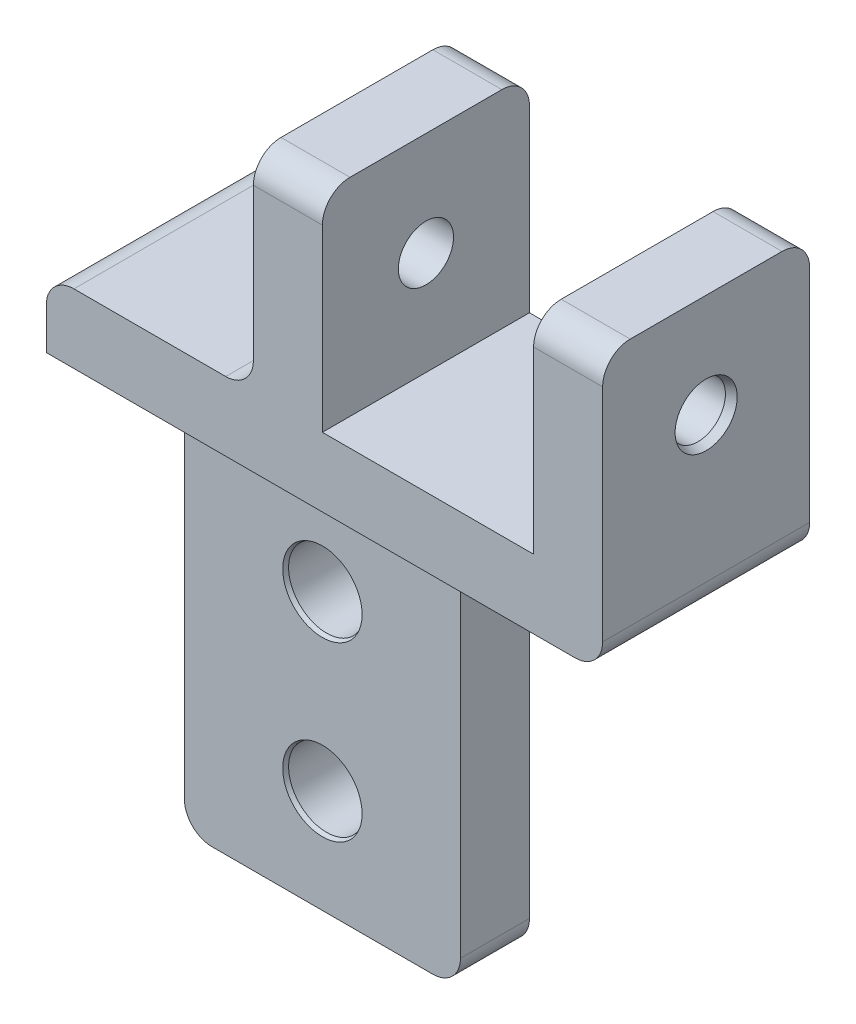
ISO-10303-21;
HEADER;
FILE_DESCRIPTION(('STEP AP214'),'2;1');
FILE_NAME('part.step','',(''),(''),'','','');
FILE_SCHEMA(('AUTOMOTIVE_DESIGN { 1 0 10303 214 1 1 1 1 }'));
ENDSEC;
DATA;
#1=APPLICATION_CONTEXT('core data for automotive mechanical design processes');
#2=APPLICATION_PROTOCOL_DEFINITION('international standard','automotive_design',2000,#1);
#3=PRODUCT_CONTEXT('',#1,'mechanical');
#4=PRODUCT('Part','Part','',(#3));
#5=PRODUCT_RELATED_PRODUCT_CATEGORY('part','',(#4));
#6=PRODUCT_DEFINITION_FORMATION('','',#4);
#7=PRODUCT_DEFINITION_CONTEXT('part definition',#1,'design');
#8=PRODUCT_DEFINITION('design','',#6,#7);
#9=PRODUCT_DEFINITION_SHAPE('','',#8);
#10=(LENGTH_UNIT() NAMED_UNIT(*) SI_UNIT(.MILLI.,.METRE.));
#11=(NAMED_UNIT(*) PLANE_ANGLE_UNIT() SI_UNIT($,.RADIAN.));
#12=(NAMED_UNIT(*) SI_UNIT($,.STERADIAN.) SOLID_ANGLE_UNIT());
#13=UNCERTAINTY_MEASURE_WITH_UNIT(LENGTH_MEASURE(1.E-05),#10,'distance_accuracy_value','');
#14=(GEOMETRIC_REPRESENTATION_CONTEXT(3) GLOBAL_UNCERTAINTY_ASSIGNED_CONTEXT((#13)) GLOBAL_UNIT_ASSIGNED_CONTEXT((#10,
#11,#12)) REPRESENTATION_CONTEXT('',''));
#15=CARTESIAN_POINT('',(0.,0.,0.));
#16=DIRECTION('',(0.,0.,1.));
#17=DIRECTION('',(1.,0.,0.));
#18=AXIS2_PLACEMENT_3D('',#15,#16,#17);
#19=CARTESIAN_POINT('',(20.,0.,0.));
#20=DIRECTION('',(0.,0.,-1.));
#21=DIRECTION('',(0.,1.,0.));
#22=AXIS2_PLACEMENT_3D('',#19,#20,#21);
#23=PLANE('',#22);
#24=DIRECTION('',(-1.,0.,0.));
#25=VECTOR('',#24,1.);
#26=CARTESIAN_POINT('',(20.,-20.,0.));
#27=LINE('',#26,#25);
#28=CARTESIAN_POINT('',(18.,-20.,0.));
#29=VERTEX_POINT('',#28);
#30=CARTESIAN_POINT('',(2.,-20.,0.));
#31=VERTEX_POINT('',#30);
#32=EDGE_CURVE('E240',#29,#31,#27,.T.);
#33=ORIENTED_EDGE('',*,*,#32,.F.);
#34=CARTESIAN_POINT('',(18.,-18.,0.));
#35=DIRECTION('',(0.,0.,-1.));
#36=DIRECTION('',(0.,1.,0.));
#37=AXIS2_PLACEMENT_3D('',#34,#35,#36);
#38=CIRCLE('',#37,2.);
#39=CARTESIAN_POINT('',(20.,-18.,0.));
#40=VERTEX_POINT('',#39);
#41=EDGE_CURVE('E362',#29,#40,#38,.F.);
#42=ORIENTED_EDGE('',*,*,#41,.T.);
#43=DIRECTION('',(0.,-1.,0.));
#44=VECTOR('',#43,1.);
#45=CARTESIAN_POINT('',(20.,0.,0.));
#46=LINE('',#45,#44);
#47=CARTESIAN_POINT('',(20.,7.49999999999995,0.));
#48=VERTEX_POINT('',#47);
#49=EDGE_CURVE('E405',#48,#40,#46,.T.);
#50=ORIENTED_EDGE('',*,*,#49,.F.);
#51=DIRECTION('',(-1.,0.,0.));
#52=VECTOR('',#51,1.);
#53=CARTESIAN_POINT('',(0.,7.49999999999995,0.));
#54=LINE('',#53,#52);
#55=CARTESIAN_POINT('',(0.,7.49999999999995,0.));
#56=VERTEX_POINT('',#55);
#57=EDGE_CURVE('E253',#48,#56,#54,.T.);
#58=ORIENTED_EDGE('',*,*,#57,.T.);
#59=DIRECTION('',(0.,-1.,0.));
#60=VECTOR('',#59,1.);
#61=CARTESIAN_POINT('',(0.,0.,0.));
#62=LINE('',#61,#60);
#63=CARTESIAN_POINT('',(0.,-18.,0.));
#64=VERTEX_POINT('',#63);
#65=EDGE_CURVE('E416',#56,#64,#62,.T.);
#66=ORIENTED_EDGE('',*,*,#65,.T.);
#67=CARTESIAN_POINT('',(2.,-18.,0.));
#68=DIRECTION('',(0.,0.,-1.));
#69=DIRECTION('',(0.,1.,0.));
#70=AXIS2_PLACEMENT_3D('',#67,#68,#69);
#71=CIRCLE('',#70,2.);
#72=EDGE_CURVE('E360',#64,#31,#71,.F.);
#73=ORIENTED_EDGE('',*,*,#72,.T.);
#74=EDGE_LOOP('',(#33,#42,#50,#58,#66,#73));
#75=FACE_BOUND('',#74,.T.);
#76=CARTESIAN_POINT('',(10.,-12.5,0.));
#77=DIRECTION('',(0.,0.,1.));
#78=DIRECTION('',(1.,0.,0.));
#79=AXIS2_PLACEMENT_3D('',#76,#77,#78);
#80=CIRCLE('',#79,2.875);
#81=CARTESIAN_POINT('',(12.875,-12.5,0.));
#82=VERTEX_POINT('',#81);
#83=EDGE_CURVE('E540',#82,#82,#80,.T.);
#84=ORIENTED_EDGE('',*,*,#83,.F.);
#85=EDGE_LOOP('',(#84));
#86=FACE_BOUND('',#85,.T.);
#87=CARTESIAN_POINT('',(10.,0.,0.));
#88=DIRECTION('',(0.,0.,1.));
#89=DIRECTION('',(1.,0.,0.));
#90=AXIS2_PLACEMENT_3D('',#87,#88,#89);
#91=CIRCLE('',#90,2.875);
#92=CARTESIAN_POINT('',(12.875,0.,0.));
#93=VERTEX_POINT('',#92);
#94=EDGE_CURVE('E549',#93,#93,#91,.T.);
#95=ORIENTED_EDGE('',*,*,#94,.F.);
#96=EDGE_LOOP('',(#95));
#97=FACE_BOUND('',#96,.T.);
#98=ADVANCED_FACE('F45',(#75,#86,#97),#23,.F.);
#99=CARTESIAN_POINT('',(20.,20.,0.));
#100=DIRECTION('',(0.,-1.,0.));
#101=DIRECTION('',(0.,0.,-1.));
#102=AXIS2_PLACEMENT_3D('',#99,#100,#101);
#103=PLANE('',#102);
#104=DIRECTION('',(-1.,0.,0.));
#105=VECTOR('',#104,1.);
#106=CARTESIAN_POINT('',(20.,20.,10.));
#107=LINE('',#106,#105);
#108=CARTESIAN_POINT('',(13.,20.,10.));
#109=VERTEX_POINT('',#108);
#110=CARTESIAN_POINT('',(2.,20.,10.));
#111=VERTEX_POINT('',#110);
#112=EDGE_CURVE('E245',#109,#111,#107,.T.);
#113=ORIENTED_EDGE('',*,*,#112,.F.);
#114=DIRECTION('',(0.,0.,-1.));
#115=VECTOR('',#114,1.);
#116=CARTESIAN_POINT('',(13.,20.,0.));
#117=LINE('',#116,#115);
#118=CARTESIAN_POINT('',(13.,20.,-4.99999999999999));
#119=VERTEX_POINT('',#118);
#120=EDGE_CURVE('E313',#109,#119,#117,.T.);
#121=ORIENTED_EDGE('',*,*,#120,.T.);
#122=DIRECTION('',(-1.,0.,0.));
#123=VECTOR('',#122,1.);
#124=CARTESIAN_POINT('',(20.,20.,-4.99999999999999));
#125=LINE('',#124,#123);
#126=CARTESIAN_POINT('',(2.,20.,-4.99999999999999));
#127=VERTEX_POINT('',#126);
#128=EDGE_CURVE('E237',#119,#127,#125,.T.);
#129=ORIENTED_EDGE('',*,*,#128,.T.);
#130=DIRECTION('',(0.,0.,1.));
#131=VECTOR('',#130,1.);
#132=CARTESIAN_POINT('',(2.,20.,0.));
#133=LINE('',#132,#131);
#134=EDGE_CURVE('E310',#127,#111,#133,.T.);
#135=ORIENTED_EDGE('',*,*,#134,.T.);
#136=EDGE_LOOP('',(#113,#121,#129,#135));
#137=FACE_BOUND('',#136,.T.);
#138=ADVANCED_FACE('F401',(#137),#103,.F.);
#139=CARTESIAN_POINT('',(35.3,20.,-4.99999999999999));
#140=VERTEX_POINT('',#139);
#141=CARTESIAN_POINT('',(20.,20.,-4.99999999999999));
#142=VERTEX_POINT('',#141);
#143=EDGE_CURVE('E216',#140,#142,#125,.T.);
#144=ORIENTED_EDGE('',*,*,#143,.T.);
#145=DIRECTION('',(0.,0.,1.));
#146=VECTOR('',#145,1.);
#147=CARTESIAN_POINT('',(20.,20.,0.));
#148=LINE('',#147,#146);
#149=CARTESIAN_POINT('',(20.,20.,10.));
#150=VERTEX_POINT('',#149);
#151=EDGE_CURVE('E224',#142,#150,#148,.T.);
#152=ORIENTED_EDGE('',*,*,#151,.T.);
#153=CARTESIAN_POINT('',(35.3,20.,10.));
#154=VERTEX_POINT('',#153);
#155=EDGE_CURVE('E243',#154,#150,#107,.T.);
#156=ORIENTED_EDGE('',*,*,#155,.F.);
#157=DIRECTION('',(0.,0.,1.));
#158=VECTOR('',#157,1.);
#159=CARTESIAN_POINT('',(35.3,20.,-4.99999999999999));
#160=LINE('',#159,#158);
#161=EDGE_CURVE('E231',#140,#154,#160,.T.);
#162=ORIENTED_EDGE('',*,*,#161,.F.);
#163=EDGE_LOOP('',(#144,#152,#156,#162));
#164=FACE_BOUND('',#163,.T.);
#165=ADVANCED_FACE('F234',(#164),#103,.F.);
#166=CARTESIAN_POINT('',(20.,0.,9.99999999999999));
#167=DIRECTION('',(0.,0.,-1.));
#168=DIRECTION('',(0.,1.,0.));
#169=AXIS2_PLACEMENT_3D('',#166,#167,#168);
#170=PLANE('',#169);
#171=ORIENTED_EDGE('',*,*,#112,.T.);
#172=CARTESIAN_POINT('',(2.,18.,10.));
#173=DIRECTION('',(0.,0.,-1.));
#174=DIRECTION('',(0.,1.,0.));
#175=AXIS2_PLACEMENT_3D('',#172,#173,#174);
#176=CIRCLE('',#175,2.);
#177=CARTESIAN_POINT('',(0.,18.,10.));
#178=VERTEX_POINT('',#177);
#179=EDGE_CURVE('E328',#111,#178,#176,.F.);
#180=ORIENTED_EDGE('',*,*,#179,.T.);
#181=DIRECTION('',(0.,-1.,0.));
#182=VECTOR('',#181,1.);
#183=CARTESIAN_POINT('',(0.,0.,9.99999999999999));
#184=LINE('',#183,#182);
#185=CARTESIAN_POINT('',(0.,15.,10.));
#186=VERTEX_POINT('',#185);
#187=EDGE_CURVE('E414',#178,#186,#184,.T.);
#188=ORIENTED_EDGE('',*,*,#187,.T.);
#189=DIRECTION('',(-1.,0.,0.));
#190=VECTOR('',#189,1.);
#191=CARTESIAN_POINT('',(20.,15.,10.));
#192=LINE('',#191,#190);
#193=CARTESIAN_POINT('',(27.5,15.,10.));
#194=VERTEX_POINT('',#193);
#195=EDGE_CURVE('E250',#194,#186,#192,.T.);
#196=ORIENTED_EDGE('',*,*,#195,.F.);
#197=CARTESIAN_POINT('',(38.3,15.,10.));
#198=VERTEX_POINT('',#197);
#199=EDGE_CURVE('E251',#198,#194,#192,.T.);
#200=ORIENTED_EDGE('',*,*,#199,.F.);
#201=CARTESIAN_POINT('',(38.3,17.,10.));
#202=DIRECTION('',(0.,0.,-1.));
#203=DIRECTION('',(0.,1.,0.));
#204=AXIS2_PLACEMENT_3D('',#201,#202,#203);
#205=CIRCLE('',#204,2.);
#206=CARTESIAN_POINT('',(40.3,17.,10.));
#207=VERTEX_POINT('',#206);
#208=EDGE_CURVE('E326',#198,#207,#205,.F.);
#209=ORIENTED_EDGE('',*,*,#208,.T.);
#210=DIRECTION('',(0.,-1.,0.));
#211=VECTOR('',#210,1.);
#212=CARTESIAN_POINT('',(40.3,20.,10.));
#213=LINE('',#212,#211);
#214=CARTESIAN_POINT('',(40.3,33.,10.));
#215=VERTEX_POINT('',#214);
#216=EDGE_CURVE('E493',#215,#207,#213,.T.);
#217=ORIENTED_EDGE('',*,*,#216,.F.);
#218=DIRECTION('',(1.,0.,0.));
#219=VECTOR('',#218,1.);
#220=CARTESIAN_POINT('',(35.3,33.,10.));
#221=LINE('',#220,#219);
#222=CARTESIAN_POINT('',(35.3,33.,10.));
#223=VERTEX_POINT('',#222);
#224=EDGE_CURVE('E324',#215,#223,#221,.F.);
#225=ORIENTED_EDGE('',*,*,#224,.T.);
#226=DIRECTION('',(0.,-1.,0.));
#227=VECTOR('',#226,1.);
#228=CARTESIAN_POINT('',(35.3,35.,10.));
#229=LINE('',#228,#227);
#230=EDGE_CURVE('E510',#223,#154,#229,.T.);
#231=ORIENTED_EDGE('',*,*,#230,.T.);
#232=ORIENTED_EDGE('',*,*,#155,.T.);
#233=DIRECTION('',(0.,-1.,0.));
#234=VECTOR('',#233,1.);
#235=CARTESIAN_POINT('',(20.,35.,10.));
#236=LINE('',#235,#234);
#237=CARTESIAN_POINT('',(20.,33.,10.));
#238=VERTEX_POINT('',#237);
#239=EDGE_CURVE('E220',#238,#150,#236,.T.);
#240=ORIENTED_EDGE('',*,*,#239,.F.);
#241=DIRECTION('',(1.,0.,0.));
#242=VECTOR('',#241,1.);
#243=CARTESIAN_POINT('',(15.,33.,10.));
#244=LINE('',#243,#242);
#245=CARTESIAN_POINT('',(15.,33.,10.));
#246=VERTEX_POINT('',#245);
#247=EDGE_CURVE('E322',#238,#246,#244,.F.);
#248=ORIENTED_EDGE('',*,*,#247,.T.);
#249=DIRECTION('',(0.,-1.,0.));
#250=VECTOR('',#249,1.);
#251=CARTESIAN_POINT('',(15.,35.,10.));
#252=LINE('',#251,#250);
#253=CARTESIAN_POINT('',(15.,22.,10.));
#254=VERTEX_POINT('',#253);
#255=EDGE_CURVE('E399',#246,#254,#252,.T.);
#256=ORIENTED_EDGE('',*,*,#255,.T.);
#257=CARTESIAN_POINT('',(13.,22.,10.));
#258=DIRECTION('',(0.,0.,-1.));
#259=DIRECTION('',(0.,1.,0.));
#260=AXIS2_PLACEMENT_3D('',#257,#258,#259);
#261=CIRCLE('',#260,2.);
#262=EDGE_CURVE('E11',#254,#109,#261,.T.);
#263=ORIENTED_EDGE('',*,*,#262,.T.);
#264=EDGE_LOOP('',(#171,#180,#188,#196,#200,#209,#217,#225,#231,#232,#240,#248,#256,#263));
#265=FACE_BOUND('',#264,.T.);
#266=ADVANCED_FACE('F292',(#265),#170,.F.);
#267=CARTESIAN_POINT('',(20.,15.,0.));
#268=DIRECTION('',(0.,1.,0.));
#269=DIRECTION('',(0.,0.,1.));
#270=AXIS2_PLACEMENT_3D('',#267,#268,#269);
#271=PLANE('',#270);
#272=DIRECTION('',(-1.,0.,0.));
#273=VECTOR('',#272,1.);
#274=CARTESIAN_POINT('',(40.3,15.,-4.99999999999999));
#275=LINE('',#274,#273);
#276=CARTESIAN_POINT('',(38.3,15.,-4.99999999999999));
#277=VERTEX_POINT('',#276);
#278=CARTESIAN_POINT('',(27.5,15.,-4.99999999999999));
#279=VERTEX_POINT('',#278);
#280=EDGE_CURVE('E417',#277,#279,#275,.T.);
#281=ORIENTED_EDGE('',*,*,#280,.F.);
#282=DIRECTION('',(0.,0.,-1.));
#283=VECTOR('',#282,1.);
#284=CARTESIAN_POINT('',(38.3,15.,10.));
#285=LINE('',#284,#283);
#286=EDGE_CURVE('E353',#277,#198,#285,.F.);
#287=ORIENTED_EDGE('',*,*,#286,.T.);
#288=ORIENTED_EDGE('',*,*,#199,.T.);
#289=DIRECTION('',(0.,0.,-1.));
#290=VECTOR('',#289,1.);
#291=CARTESIAN_POINT('',(27.5,15.,0.));
#292=LINE('',#291,#290);
#293=EDGE_CURVE('E259',#194,#279,#292,.T.);
#294=ORIENTED_EDGE('',*,*,#293,.T.);
#295=EDGE_LOOP('',(#281,#287,#288,#294));
#296=FACE_BOUND('',#295,.T.);
#297=ADVANCED_FACE('F480',(#296),#271,.F.);
#298=CARTESIAN_POINT('',(20.,-20.,0.));
#299=DIRECTION('',(0.,-1.,0.));
#300=DIRECTION('',(0.,0.,-1.));
#301=AXIS2_PLACEMENT_3D('',#298,#299,#300);
#302=PLANE('',#301);
#303=DIRECTION('',(-1.,0.,0.));
#304=VECTOR('',#303,1.);
#305=CARTESIAN_POINT('',(20.,-20.,-4.99999999999999));
#306=LINE('',#305,#304);
#307=CARTESIAN_POINT('',(18.,-20.,-4.99999999999999));
#308=VERTEX_POINT('',#307);
#309=CARTESIAN_POINT('',(2.,-20.,-4.99999999999999));
#310=VERTEX_POINT('',#309);
#311=EDGE_CURVE('E236',#308,#310,#306,.T.);
#312=ORIENTED_EDGE('',*,*,#311,.F.);
#313=DIRECTION('',(0.,0.,1.));
#314=VECTOR('',#313,1.);
#315=CARTESIAN_POINT('',(18.,-20.,0.));
#316=LINE('',#315,#314);
#317=EDGE_CURVE('E357',#308,#29,#316,.T.);
#318=ORIENTED_EDGE('',*,*,#317,.T.);
#319=ORIENTED_EDGE('',*,*,#32,.T.);
#320=DIRECTION('',(0.,0.,1.));
#321=VECTOR('',#320,1.);
#322=CARTESIAN_POINT('',(2.,-20.,-4.99999999999999));
#323=LINE('',#322,#321);
#324=EDGE_CURVE('E355',#31,#310,#323,.F.);
#325=ORIENTED_EDGE('',*,*,#324,.T.);
#326=EDGE_LOOP('',(#312,#318,#319,#325));
#327=FACE_BOUND('',#326,.T.);
#328=ADVANCED_FACE('F436',(#327),#302,.T.);
#329=CARTESIAN_POINT('',(20.,0.,-4.99999999999999));
#330=DIRECTION('',(0.,0.,-1.));
#331=DIRECTION('',(-1.,0.,0.));
#332=AXIS2_PLACEMENT_3D('',#329,#330,#331);
#333=PLANE('',#332);
#334=CARTESIAN_POINT('',(10.,0.,-4.99999999999999));
#335=DIRECTION('',(0.,0.,-1.));
#336=DIRECTION('',(-1.,0.,0.));
#337=AXIS2_PLACEMENT_3D('',#334,#335,#336);
#338=CIRCLE('',#337,2.75);
#339=CARTESIAN_POINT('',(7.25,0.,-4.99999999999999));
#340=VERTEX_POINT('',#339);
#341=EDGE_CURVE('E543',#340,#340,#338,.T.);
#342=ORIENTED_EDGE('',*,*,#341,.F.);
#343=EDGE_LOOP('',(#342));
#344=FACE_BOUND('',#343,.T.);
#345=CARTESIAN_POINT('',(10.,-12.5,-4.99999999999999));
#346=DIRECTION('',(0.,0.,-1.));
#347=DIRECTION('',(-1.,0.,0.));
#348=AXIS2_PLACEMENT_3D('',#345,#346,#347);
#349=CIRCLE('',#348,2.75);
#350=CARTESIAN_POINT('',(7.25,-12.5,-4.99999999999999));
#351=VERTEX_POINT('',#350);
#352=EDGE_CURVE('E534',#351,#351,#349,.T.);
#353=ORIENTED_EDGE('',*,*,#352,.F.);
#354=EDGE_LOOP('',(#353));
#355=FACE_BOUND('',#354,.T.);
#356=DIRECTION('',(0.,-1.,0.));
#357=VECTOR('',#356,1.);
#358=CARTESIAN_POINT('',(0.,0.,-4.99999999999999));
#359=LINE('',#358,#357);
#360=CARTESIAN_POINT('',(0.,18.,-4.99999999999999));
#361=VERTEX_POINT('',#360);
#362=CARTESIAN_POINT('',(0.,-18.,-4.99999999999999));
#363=VERTEX_POINT('',#362);
#364=EDGE_CURVE('E410',#361,#363,#359,.T.);
#365=ORIENTED_EDGE('',*,*,#364,.F.);
#366=CARTESIAN_POINT('',(2.,18.,-4.99999999999999));
#367=DIRECTION('',(0.,0.,-1.));
#368=DIRECTION('',(-1.,0.,0.));
#369=AXIS2_PLACEMENT_3D('',#366,#367,#368);
#370=CIRCLE('',#369,2.);
#371=EDGE_CURVE('E344',#361,#127,#370,.T.);
#372=ORIENTED_EDGE('',*,*,#371,.T.);
#373=ORIENTED_EDGE('',*,*,#128,.F.);
#374=CARTESIAN_POINT('',(13.,22.,-4.99999999999999));
#375=DIRECTION('',(0.,0.,-1.));
#376=DIRECTION('',(-1.,0.,0.));
#377=AXIS2_PLACEMENT_3D('',#374,#375,#376);
#378=CIRCLE('',#377,2.);
#379=CARTESIAN_POINT('',(15.,22.,-4.99999999999999));
#380=VERTEX_POINT('',#379);
#381=EDGE_CURVE('E53',#119,#380,#378,.F.);
#382=ORIENTED_EDGE('',*,*,#381,.T.);
#383=DIRECTION('',(0.,-1.,0.));
#384=VECTOR('',#383,1.);
#385=CARTESIAN_POINT('',(15.,35.,-4.99999999999999));
#386=LINE('',#385,#384);
#387=CARTESIAN_POINT('',(15.,33.,-4.99999999999999));
#388=VERTEX_POINT('',#387);
#389=EDGE_CURVE('E221',#388,#380,#386,.T.);
#390=ORIENTED_EDGE('',*,*,#389,.F.);
#391=DIRECTION('',(-1.,0.,0.));
#392=VECTOR('',#391,1.);
#393=CARTESIAN_POINT('',(20.,33.,-4.99999999999999));
#394=LINE('',#393,#392);
#395=CARTESIAN_POINT('',(20.,33.,-4.99999999999999));
#396=VERTEX_POINT('',#395);
#397=EDGE_CURVE('E219',#388,#396,#394,.F.);
#398=ORIENTED_EDGE('',*,*,#397,.T.);
#399=DIRECTION('',(0.,-1.,0.));
#400=VECTOR('',#399,1.);
#401=CARTESIAN_POINT('',(20.,35.,-4.99999999999999));
#402=LINE('',#401,#400);
#403=EDGE_CURVE('E210',#396,#142,#402,.T.);
#404=ORIENTED_EDGE('',*,*,#403,.T.);
#405=ORIENTED_EDGE('',*,*,#143,.F.);
#406=DIRECTION('',(0.,-1.,0.));
#407=VECTOR('',#406,1.);
#408=CARTESIAN_POINT('',(35.3,35.,-4.99999999999999));
#409=LINE('',#408,#407);
#410=CARTESIAN_POINT('',(35.3,33.,-4.99999999999999));
#411=VERTEX_POINT('',#410);
#412=EDGE_CURVE('E308',#411,#140,#409,.T.);
#413=ORIENTED_EDGE('',*,*,#412,.F.);
#414=DIRECTION('',(-1.,0.,0.));
#415=VECTOR('',#414,1.);
#416=CARTESIAN_POINT('',(20.,33.,-4.99999999999999));
#417=LINE('',#416,#415);
#418=CARTESIAN_POINT('',(40.3,33.,-4.99999999999999));
#419=VERTEX_POINT('',#418);
#420=EDGE_CURVE('E336',#411,#419,#417,.F.);
#421=ORIENTED_EDGE('',*,*,#420,.T.);
#422=DIRECTION('',(0.,1.,0.));
#423=VECTOR('',#422,1.);
#424=CARTESIAN_POINT('',(40.3,15.,-4.99999999999999));
#425=LINE('',#424,#423);
#426=CARTESIAN_POINT('',(40.3,17.,-4.99999999999999));
#427=VERTEX_POINT('',#426);
#428=EDGE_CURVE('E489',#427,#419,#425,.T.);
#429=ORIENTED_EDGE('',*,*,#428,.F.);
#430=CARTESIAN_POINT('',(38.3,17.,-4.99999999999999));
#431=DIRECTION('',(0.,0.,-1.));
#432=DIRECTION('',(-1.,0.,0.));
#433=AXIS2_PLACEMENT_3D('',#430,#431,#432);
#434=CIRCLE('',#433,2.);
#435=EDGE_CURVE('E342',#427,#277,#434,.T.);
#436=ORIENTED_EDGE('',*,*,#435,.T.);
#437=ORIENTED_EDGE('',*,*,#280,.T.);
#438=CARTESIAN_POINT('',(27.5,7.5,-4.99999999999999));
#439=DIRECTION('',(0.,0.,-1.));
#440=DIRECTION('',(-1.,0.,0.));
#441=AXIS2_PLACEMENT_3D('',#438,#439,#440);
#442=CIRCLE('',#441,7.5);
#443=CARTESIAN_POINT('',(20.,7.5,-4.99999999999999));
#444=VERTEX_POINT('',#443);
#445=EDGE_CURVE('E266',#279,#444,#442,.F.);
#446=ORIENTED_EDGE('',*,*,#445,.T.);
#447=DIRECTION('',(0.,-1.,0.));
#448=VECTOR('',#447,1.);
#449=CARTESIAN_POINT('',(20.,0.,-4.99999999999999));
#450=LINE('',#449,#448);
#451=CARTESIAN_POINT('',(20.,-18.,-4.99999999999999));
#452=VERTEX_POINT('',#451);
#453=EDGE_CURVE('E403',#444,#452,#450,.T.);
#454=ORIENTED_EDGE('',*,*,#453,.T.);
#455=CARTESIAN_POINT('',(18.,-18.,-4.99999999999999));
#456=DIRECTION('',(0.,0.,-1.));
#457=DIRECTION('',(-1.,0.,0.));
#458=AXIS2_PLACEMENT_3D('',#455,#456,#457);
#459=CIRCLE('',#458,2.);
#460=EDGE_CURVE('E340',#452,#308,#459,.T.);
#461=ORIENTED_EDGE('',*,*,#460,.T.);
#462=ORIENTED_EDGE('',*,*,#311,.T.);
#463=CARTESIAN_POINT('',(2.,-18.,-4.99999999999999));
#464=DIRECTION('',(0.,0.,-1.));
#465=DIRECTION('',(-1.,0.,0.));
#466=AXIS2_PLACEMENT_3D('',#463,#464,#465);
#467=CIRCLE('',#466,2.);
#468=EDGE_CURVE('E338',#310,#363,#467,.T.);
#469=ORIENTED_EDGE('',*,*,#468,.T.);
#470=EDGE_LOOP('',(#365,#372,#373,#382,#390,#398,#404,#405,#413,#421,#429,#436,#437,#446,#454,
#461,#462,#469));
#471=FACE_BOUND('',#470,.T.);
#472=ADVANCED_FACE('F213',(#344,#355,#471),#333,.T.);
#473=CARTESIAN_POINT('',(20.,0.,0.));
#474=DIRECTION('',(1.,0.,0.));
#475=DIRECTION('',(0.,0.,-1.));
#476=AXIS2_PLACEMENT_3D('',#473,#474,#475);
#477=PLANE('',#476);
#478=ORIENTED_EDGE('',*,*,#49,.T.);
#479=DIRECTION('',(0.,0.,1.));
#480=VECTOR('',#479,1.);
#481=CARTESIAN_POINT('',(20.,-18.,0.));
#482=LINE('',#481,#480);
#483=EDGE_CURVE('E364',#40,#452,#482,.F.);
#484=ORIENTED_EDGE('',*,*,#483,.T.);
#485=ORIENTED_EDGE('',*,*,#453,.F.);
#486=DIRECTION('',(0.,0.,-1.));
#487=VECTOR('',#486,1.);
#488=CARTESIAN_POINT('',(20.,7.5,0.));
#489=LINE('',#488,#487);
#490=EDGE_CURVE('E262',#444,#48,#489,.F.);
#491=ORIENTED_EDGE('',*,*,#490,.T.);
#492=EDGE_LOOP('',(#478,#484,#485,#491));
#493=FACE_BOUND('',#492,.T.);
#494=ADVANCED_FACE('F444',(#493),#477,.T.);
#495=CARTESIAN_POINT('',(0.,0.,0.));
#496=DIRECTION('',(1.,0.,0.));
#497=DIRECTION('',(0.,0.,-1.));
#498=AXIS2_PLACEMENT_3D('',#495,#496,#497);
#499=PLANE('',#498);
#500=ORIENTED_EDGE('',*,*,#187,.F.);
#501=DIRECTION('',(0.,0.,1.));
#502=VECTOR('',#501,1.);
#503=CARTESIAN_POINT('',(0.,18.,0.));
#504=LINE('',#503,#502);
#505=EDGE_CURVE('E333',#178,#361,#504,.F.);
#506=ORIENTED_EDGE('',*,*,#505,.T.);
#507=ORIENTED_EDGE('',*,*,#364,.T.);
#508=DIRECTION('',(0.,0.,1.));
#509=VECTOR('',#508,1.);
#510=CARTESIAN_POINT('',(0.,-18.,0.));
#511=LINE('',#510,#509);
#512=EDGE_CURVE('E330',#363,#64,#511,.T.);
#513=ORIENTED_EDGE('',*,*,#512,.T.);
#514=ORIENTED_EDGE('',*,*,#65,.F.);
#515=DIRECTION('',(0.,-0.707106781186551,-0.707106781186544));
#516=VECTOR('',#515,1.);
#517=CARTESIAN_POINT('',(0.,3.74999999999994,-3.74999999999997));
#518=LINE('',#517,#516);
#519=CARTESIAN_POINT('',(0.,12.8300947166262,5.33009471662621));
#520=VERTEX_POINT('',#519);
#521=EDGE_CURVE('E256',#56,#520,#518,.F.);
#522=ORIENTED_EDGE('',*,*,#521,.T.);
#523=CARTESIAN_POINT('',(0.,7.52679385772713,10.6333955755253));
#524=DIRECTION('',(1.,0.,0.));
#525=DIRECTION('',(0.,0.,-1.));
#526=AXIS2_PLACEMENT_3D('',#523,#524,#525);
#527=CIRCLE('',#526,7.5);
#528=EDGE_CURVE('E274',#520,#186,#527,.T.);
#529=ORIENTED_EDGE('',*,*,#528,.T.);
#530=EDGE_LOOP('',(#500,#506,#507,#513,#514,#522,#529));
#531=FACE_BOUND('',#530,.T.);
#532=ADVANCED_FACE('F423',(#531),#499,.F.);
#533=CARTESIAN_POINT('',(40.3,0.,0.));
#534=DIRECTION('',(1.,0.,0.));
#535=DIRECTION('',(0.,0.,-1.));
#536=AXIS2_PLACEMENT_3D('',#533,#534,#535);
#537=PLANE('',#536);
#538=CARTESIAN_POINT('',(40.3,27.5,2.5));
#539=DIRECTION('',(1.,0.,0.));
#540=DIRECTION('',(0.,0.,-1.));
#541=AXIS2_PLACEMENT_3D('',#538,#539,#540);
#542=CIRCLE('',#541,2.25);
#543=CARTESIAN_POINT('',(40.3,27.5,0.25));
#544=VERTEX_POINT('',#543);
#545=EDGE_CURVE('E531',#544,#544,#542,.T.);
#546=ORIENTED_EDGE('',*,*,#545,.F.);
#547=EDGE_LOOP('',(#546));
#548=FACE_BOUND('',#547,.T.);
#549=ORIENTED_EDGE('',*,*,#216,.T.);
#550=DIRECTION('',(0.,0.,-1.));
#551=VECTOR('',#550,1.);
#552=CARTESIAN_POINT('',(40.3,17.,-4.99999999999999));
#553=LINE('',#552,#551);
#554=EDGE_CURVE('E350',#207,#427,#553,.T.);
#555=ORIENTED_EDGE('',*,*,#554,.T.);
#556=ORIENTED_EDGE('',*,*,#428,.T.);
#557=CARTESIAN_POINT('',(40.3,33.,-2.99999999999999));
#558=DIRECTION('',(1.,0.,0.));
#559=DIRECTION('',(0.,0.,-1.));
#560=AXIS2_PLACEMENT_3D('',#557,#558,#559);
#561=CIRCLE('',#560,2.);
#562=CARTESIAN_POINT('',(40.3,35.,-2.99999999999999));
#563=VERTEX_POINT('',#562);
#564=EDGE_CURVE('E348',#419,#563,#561,.T.);
#565=ORIENTED_EDGE('',*,*,#564,.T.);
#566=DIRECTION('',(0.,0.,-1.));
#567=VECTOR('',#566,1.);
#568=CARTESIAN_POINT('',(40.3,35.,10.));
#569=LINE('',#568,#567);
#570=CARTESIAN_POINT('',(40.3,35.,8.00000000000002));
#571=VERTEX_POINT('',#570);
#572=EDGE_CURVE('E507',#571,#563,#569,.T.);
#573=ORIENTED_EDGE('',*,*,#572,.F.);
#574=CARTESIAN_POINT('',(40.3,33.,8.00000000000002));
#575=DIRECTION('',(1.,0.,0.));
#576=DIRECTION('',(0.,0.,-1.));
#577=AXIS2_PLACEMENT_3D('',#574,#575,#576);
#578=CIRCLE('',#577,2.);
#579=EDGE_CURVE('E346',#571,#215,#578,.T.);
#580=ORIENTED_EDGE('',*,*,#579,.T.);
#581=EDGE_LOOP('',(#549,#555,#556,#565,#573,#580));
#582=FACE_BOUND('',#581,.T.);
#583=ADVANCED_FACE('F496',(#548,#582),#537,.T.);
#584=CARTESIAN_POINT('',(35.3,35.,-4.99999999999999));
#585=DIRECTION('',(1.,0.,0.));
#586=DIRECTION('',(0.,0.,-1.));
#587=AXIS2_PLACEMENT_3D('',#584,#585,#586);
#588=PLANE('',#587);
#589=CARTESIAN_POINT('',(35.3,27.5,2.5));
#590=DIRECTION('',(1.,0.,0.));
#591=DIRECTION('',(0.,0.,-1.));
#592=AXIS2_PLACEMENT_3D('',#589,#590,#591);
#593=CIRCLE('',#592,2.);
#594=CARTESIAN_POINT('',(35.3,27.5,0.500000000000006));
#595=VERTEX_POINT('',#594);
#596=EDGE_CURVE('E525',#595,#595,#593,.T.);
#597=ORIENTED_EDGE('',*,*,#596,.T.);
#598=EDGE_LOOP('',(#597));
#599=FACE_BOUND('',#598,.T.);
#600=DIRECTION('',(0.,0.,1.));
#601=VECTOR('',#600,1.);
#602=CARTESIAN_POINT('',(35.3,35.,-4.99999999999999));
#603=LINE('',#602,#601);
#604=CARTESIAN_POINT('',(35.3,35.,-2.99999999999999));
#605=VERTEX_POINT('',#604);
#606=CARTESIAN_POINT('',(35.3,35.,8.00000000000001));
#607=VERTEX_POINT('',#606);
#608=EDGE_CURVE('E504',#605,#607,#603,.T.);
#609=ORIENTED_EDGE('',*,*,#608,.F.);
#610=CARTESIAN_POINT('',(35.3,33.,-2.99999999999999));
#611=DIRECTION('',(1.,0.,0.));
#612=DIRECTION('',(0.,0.,-1.));
#613=AXIS2_PLACEMENT_3D('',#610,#611,#612);
#614=CIRCLE('',#613,2.);
#615=EDGE_CURVE('E374',#605,#411,#614,.F.);
#616=ORIENTED_EDGE('',*,*,#615,.T.);
#617=ORIENTED_EDGE('',*,*,#412,.T.);
#618=ORIENTED_EDGE('',*,*,#161,.T.);
#619=ORIENTED_EDGE('',*,*,#230,.F.);
#620=CARTESIAN_POINT('',(35.3,33.,8.00000000000002));
#621=DIRECTION('',(1.,0.,0.));
#622=DIRECTION('',(0.,0.,-1.));
#623=AXIS2_PLACEMENT_3D('',#620,#621,#622);
#624=CIRCLE('',#623,2.);
#625=EDGE_CURVE('E372',#223,#607,#624,.F.);
#626=ORIENTED_EDGE('',*,*,#625,.T.);
#627=EDGE_LOOP('',(#609,#616,#617,#618,#619,#626));
#628=FACE_BOUND('',#627,.T.);
#629=ADVANCED_FACE('F598',(#599,#628),#588,.F.);
#630=CARTESIAN_POINT('',(0.,35.,0.));
#631=DIRECTION('',(0.,1.,0.));
#632=DIRECTION('',(0.,0.,1.));
#633=AXIS2_PLACEMENT_3D('',#630,#631,#632);
#634=PLANE('',#633);
#635=ORIENTED_EDGE('',*,*,#572,.T.);
#636=DIRECTION('',(-1.,0.,0.));
#637=VECTOR('',#636,1.);
#638=CARTESIAN_POINT('',(0.,35.,-2.99999999999999));
#639=LINE('',#638,#637);
#640=EDGE_CURVE('E369',#563,#605,#639,.T.);
#641=ORIENTED_EDGE('',*,*,#640,.T.);
#642=ORIENTED_EDGE('',*,*,#608,.T.);
#643=DIRECTION('',(1.,0.,0.));
#644=VECTOR('',#643,1.);
#645=CARTESIAN_POINT('',(40.3,35.,8.00000000000002));
#646=LINE('',#645,#644);
#647=EDGE_CURVE('E366',#607,#571,#646,.T.);
#648=ORIENTED_EDGE('',*,*,#647,.T.);
#649=EDGE_LOOP('',(#635,#641,#642,#648));
#650=FACE_BOUND('',#649,.T.);
#651=ADVANCED_FACE('F596',(#650),#634,.T.);
#652=CARTESIAN_POINT('',(15.,35.,0.));
#653=DIRECTION('',(-1.,0.,0.));
#654=DIRECTION('',(0.,0.,1.));
#655=AXIS2_PLACEMENT_3D('',#652,#653,#654);
#656=PLANE('',#655);
#657=CARTESIAN_POINT('',(15.,27.5,2.50000000000001));
#658=DIRECTION('',(-1.,0.,0.));
#659=DIRECTION('',(0.,0.,1.));
#660=AXIS2_PLACEMENT_3D('',#657,#658,#659);
#661=CIRCLE('',#660,2.25);
#662=CARTESIAN_POINT('',(15.,27.5,4.75000000000001));
#663=VERTEX_POINT('',#662);
#664=EDGE_CURVE('E522',#663,#663,#661,.T.);
#665=ORIENTED_EDGE('',*,*,#664,.F.);
#666=EDGE_LOOP('',(#665));
#667=FACE_BOUND('',#666,.T.);
#668=ORIENTED_EDGE('',*,*,#389,.T.);
#669=DIRECTION('',(0.,0.,-1.));
#670=VECTOR('',#669,1.);
#671=CARTESIAN_POINT('',(15.,22.,0.));
#672=LINE('',#671,#670);
#673=EDGE_CURVE('E320',#380,#254,#672,.F.);
#674=ORIENTED_EDGE('',*,*,#673,.T.);
#675=ORIENTED_EDGE('',*,*,#255,.F.);
#676=CARTESIAN_POINT('',(15.,33.,8.00000000000002));
#677=DIRECTION('',(-1.,0.,0.));
#678=DIRECTION('',(0.,0.,1.));
#679=AXIS2_PLACEMENT_3D('',#676,#677,#678);
#680=CIRCLE('',#679,2.);
#681=CARTESIAN_POINT('',(15.,35.,8.00000000000002));
#682=VERTEX_POINT('',#681);
#683=EDGE_CURVE('E316',#246,#682,#680,.T.);
#684=ORIENTED_EDGE('',*,*,#683,.T.);
#685=DIRECTION('',(0.,0.,-1.));
#686=VECTOR('',#685,1.);
#687=CARTESIAN_POINT('',(15.,35.,0.));
#688=LINE('',#687,#686);
#689=CARTESIAN_POINT('',(15.,35.,-2.99999999999999));
#690=VERTEX_POINT('',#689);
#691=EDGE_CURVE('E230',#682,#690,#688,.T.);
#692=ORIENTED_EDGE('',*,*,#691,.T.);
#693=CARTESIAN_POINT('',(15.,33.,-2.99999999999999));
#694=DIRECTION('',(-1.,0.,0.));
#695=DIRECTION('',(0.,0.,1.));
#696=AXIS2_PLACEMENT_3D('',#693,#694,#695);
#697=CIRCLE('',#696,2.);
#698=EDGE_CURVE('E318',#690,#388,#697,.T.);
#699=ORIENTED_EDGE('',*,*,#698,.T.);
#700=EDGE_LOOP('',(#668,#674,#675,#684,#692,#699));
#701=FACE_BOUND('',#700,.T.);
#702=ADVANCED_FACE('F388',(#667,#701),#656,.T.);
#703=CARTESIAN_POINT('',(20.,35.,0.));
#704=DIRECTION('',(1.,0.,0.));
#705=DIRECTION('',(0.,0.,-1.));
#706=AXIS2_PLACEMENT_3D('',#703,#704,#705);
#707=PLANE('',#706);
#708=CARTESIAN_POINT('',(20.,27.5,2.50000000000001));
#709=DIRECTION('',(1.,0.,0.));
#710=DIRECTION('',(0.,0.,-1.));
#711=AXIS2_PLACEMENT_3D('',#708,#709,#710);
#712=CIRCLE('',#711,2.);
#713=CARTESIAN_POINT('',(20.,27.5,0.500000000000009));
#714=VERTEX_POINT('',#713);
#715=EDGE_CURVE('E309',#714,#714,#712,.T.);
#716=ORIENTED_EDGE('',*,*,#715,.F.);
#717=EDGE_LOOP('',(#716));
#718=FACE_BOUND('',#717,.T.);
#719=ORIENTED_EDGE('',*,*,#403,.F.);
#720=CARTESIAN_POINT('',(20.,33.,-2.99999999999999));
#721=DIRECTION('',(1.,0.,0.));
#722=DIRECTION('',(0.,0.,-1.));
#723=AXIS2_PLACEMENT_3D('',#720,#721,#722);
#724=CIRCLE('',#723,2.);
#725=CARTESIAN_POINT('',(20.,35.,-2.99999999999999));
#726=VERTEX_POINT('',#725);
#727=EDGE_CURVE('E68',#396,#726,#724,.T.);
#728=ORIENTED_EDGE('',*,*,#727,.T.);
#729=DIRECTION('',(0.,0.,1.));
#730=VECTOR('',#729,1.);
#731=CARTESIAN_POINT('',(20.,35.,0.));
#732=LINE('',#731,#730);
#733=CARTESIAN_POINT('',(20.,35.,8.00000000000002));
#734=VERTEX_POINT('',#733);
#735=EDGE_CURVE('E392',#726,#734,#732,.T.);
#736=ORIENTED_EDGE('',*,*,#735,.T.);
#737=CARTESIAN_POINT('',(20.,33.,8.00000000000002));
#738=DIRECTION('',(1.,0.,0.));
#739=DIRECTION('',(0.,0.,-1.));
#740=AXIS2_PLACEMENT_3D('',#737,#738,#739);
#741=CIRCLE('',#740,2.);
#742=EDGE_CURVE('E60',#734,#238,#741,.T.);
#743=ORIENTED_EDGE('',*,*,#742,.T.);
#744=ORIENTED_EDGE('',*,*,#239,.T.);
#745=ORIENTED_EDGE('',*,*,#151,.F.);
#746=EDGE_LOOP('',(#719,#728,#736,#743,#744,#745));
#747=FACE_BOUND('',#746,.T.);
#748=ADVANCED_FACE('F225',(#718,#747),#707,.T.);
#749=CARTESIAN_POINT('',(0.,35.,0.));
#750=DIRECTION('',(0.,1.,0.));
#751=DIRECTION('',(0.,0.,1.));
#752=AXIS2_PLACEMENT_3D('',#749,#750,#751);
#753=PLANE('',#752);
#754=ORIENTED_EDGE('',*,*,#735,.F.);
#755=DIRECTION('',(-1.,0.,0.));
#756=VECTOR('',#755,1.);
#757=CARTESIAN_POINT('',(0.,35.,-2.99999999999999));
#758=LINE('',#757,#756);
#759=EDGE_CURVE('E378',#726,#690,#758,.T.);
#760=ORIENTED_EDGE('',*,*,#759,.T.);
#761=ORIENTED_EDGE('',*,*,#691,.F.);
#762=DIRECTION('',(1.,0.,0.));
#763=VECTOR('',#762,1.);
#764=CARTESIAN_POINT('',(20.,35.,8.00000000000002));
#765=LINE('',#764,#763);
#766=EDGE_CURVE('E376',#682,#734,#765,.T.);
#767=ORIENTED_EDGE('',*,*,#766,.T.);
#768=EDGE_LOOP('',(#754,#760,#761,#767));
#769=FACE_BOUND('',#768,.T.);
#770=ADVANCED_FACE('F290',(#769),#753,.T.);
#771=CARTESIAN_POINT('',(20.,7.49999999999995,0.));
#772=DIRECTION('',(0.,-0.707106781186544,0.707106781186551));
#773=DIRECTION('',(1.,0.,0.));
#774=AXIS2_PLACEMENT_3D('',#771,#772,#773);
#775=PLANE('',#774);
#776=CARTESIAN_POINT('',(27.5,7.5,0.));
#777=DIRECTION('',(0.,-0.707106781186544,0.707106781186551));
#778=DIRECTION('',(0.,-0.707106781186551,-0.707106781186544));
#779=AXIS2_PLACEMENT_3D('',#776,#777,#778);
#780=ELLIPSE('',#779,10.6066017177982,7.5);
#781=CARTESIAN_POINT('',(22.2236290585485,12.8300947166262,5.33009471662621));
#782=VERTEX_POINT('',#781);
#783=EDGE_CURVE('E268',#48,#782,#780,.F.);
#784=ORIENTED_EDGE('',*,*,#783,.T.);
#785=CARTESIAN_POINT('',(22.2236290585485,12.8300947166262,5.33009471662621));
#786=CARTESIAN_POINT('',(20.,12.8300947166262,5.33009471662621));
#787=B_SPLINE_CURVE_WITH_KNOTS('',1,(#785,#786),.UNSPECIFIED.,.F.,.F.,(2,2),(0.,1.),.UNSPECIFIED.);
#788=CARTESIAN_POINT('',(20.,12.8300947166262,5.33009471662621));
#789=VERTEX_POINT('',#788);
#790=EDGE_CURVE('E270',#782,#789,#787,.T.);
#791=ORIENTED_EDGE('',*,*,#790,.T.);
#792=DIRECTION('',(1.,0.,0.));
#793=VECTOR('',#792,1.);
#794=CARTESIAN_POINT('',(20.,12.8300947166262,5.33009471662621));
#795=LINE('',#794,#793);
#796=EDGE_CURVE('E264',#789,#520,#795,.F.);
#797=ORIENTED_EDGE('',*,*,#796,.T.);
#798=ORIENTED_EDGE('',*,*,#521,.F.);
#799=ORIENTED_EDGE('',*,*,#57,.F.);
#800=EDGE_LOOP('',(#784,#791,#797,#798,#799));
#801=FACE_BOUND('',#800,.T.);
#802=ADVANCED_FACE('F277',(#801),#775,.T.);
#803=CARTESIAN_POINT('',(20.,7.52679385772713,10.6333955755253));
#804=DIRECTION('',(-1.,0.,0.));
#805=DIRECTION('',(0.,0.,1.));
#806=AXIS2_PLACEMENT_3D('',#803,#804,#805);
#807=CYLINDRICAL_SURFACE('',#806,7.5);
#808=ORIENTED_EDGE('',*,*,#796,.F.);
#809=ORIENTED_EDGE('',*,*,#790,.F.);
#810=CARTESIAN_POINT('',(22.2236290585485,12.8300947166262,5.33009471662621));
#811=CARTESIAN_POINT('',(22.316562307737,12.9220844170256,5.42209089391141));
#812=CARTESIAN_POINT('',(22.4110866227891,13.0108514292285,5.51563832779109));
#813=CARTESIAN_POINT('',(22.6029907822679,13.1820637371168,5.7054878907858));
#814=CARTESIAN_POINT('',(22.7003699347675,13.2645105474024,5.80178935227044));
#815=CARTESIAN_POINT('',(22.9961508505615,13.5024451499448,6.09415598497189));
#816=CARTESIAN_POINT('',(23.1984021293514,13.6487290945999,6.29388749163159));
#817=CARTESIAN_POINT('',(23.6100506489074,13.9170400884841,6.69973522566531));
#818=CARTESIAN_POINT('',(23.8194121360706,14.0391720532022,6.90581913238904));
#819=CARTESIAN_POINT('',(24.2446656624135,14.2609400972215,7.32324579516999));
#820=CARTESIAN_POINT('',(24.4605574399098,14.3605770765965,7.53458834044173));
#821=CARTESIAN_POINT('',(24.8616381954336,14.5233733844055,7.92509276355601));
#822=CARTESIAN_POINT('',(25.0459718758811,14.5898426419661,8.10377023623025));
#823=CARTESIAN_POINT('',(25.4184216923067,14.7079989506588,8.461826211449));
#824=CARTESIAN_POINT('',(25.6065350062482,14.7596966218054,8.64120411588921));
#825=CARTESIAN_POINT('',(25.913881701952,14.8313393361199,8.92860994920493));
#826=CARTESIAN_POINT('',(26.0314845870633,14.8558176488961,9.03728520686876));
#827=CARTESIAN_POINT('',(26.2698184299561,14.8994198885279,9.2526800707119));
#828=CARTESIAN_POINT('',(26.3905531472878,14.9185370206515,9.35939703639073));
#829=CARTESIAN_POINT('',(26.6041695719988,14.9468597335933,9.53862194219819));
#830=CARTESIAN_POINT('',(26.6957147279826,14.957347145998,9.6125519046241));
#831=CARTESIAN_POINT('',(26.8846841125557,14.9753261668152,9.75349931963979));
#832=CARTESIAN_POINT('',(26.98210086262,14.9828214971027,9.82052528264033));
#833=CARTESIAN_POINT('',(27.1287793129475,14.990929641689,9.90040263619475));
#834=CARTESIAN_POINT('',(27.1729882647741,14.9930069207089,9.92205045432143));
#835=CARTESIAN_POINT('',(27.2638737447731,14.9964185455422,9.95882916023081));
#836=CARTESIAN_POINT('',(27.3105293317629,14.9977583345925,9.97400760364164));
#837=CARTESIAN_POINT('',(27.3814140657683,14.9990981862055,9.98942628896862));
#838=CARTESIAN_POINT('',(27.404836460503,14.9994328897941,9.99333447994695));
#839=CARTESIAN_POINT('',(27.4521603296964,14.9998854351624,9.9986482696319));
#840=CARTESIAN_POINT('',(27.4760641747172,15.0000014343384,10.0000326014161));
#841=CARTESIAN_POINT('',(27.5,15.,10.));
#842=B_SPLINE_CURVE_WITH_KNOTS('',3,(#810,#811,#812,#813,#814,#815,#816,#817,#818,#819,#820,
#821,#822,#823,#824,#825,#826,#827,#828,#829,#830,#831,#832,#833,#834,#835,#836,#837,#838,#839,
#840,#841),.UNSPECIFIED.,.F.,.F.,(4,2,2,2,2,2,2,2,2,2,2,2,2,2,2,4),(0.,0.479532213755818,
0.958949148762005,1.91672670877943,2.8702476204828,3.82373037295465,4.6188687264388,
5.41343396940256,5.89933133756933,6.38584177470645,6.7402773264353,7.09427060872577,
7.2417978691869,7.38822114470504,7.45933859673955,7.53105258760489),.UNSPECIFIED.);
#843=EDGE_CURVE('E301',#194,#782,#842,.F.);
#844=ORIENTED_EDGE('',*,*,#843,.F.);
#845=ORIENTED_EDGE('',*,*,#195,.T.);
#846=ORIENTED_EDGE('',*,*,#528,.F.);
#847=EDGE_LOOP('',(#808,#809,#844,#845,#846));
#848=FACE_BOUND('',#847,.T.);
#849=ADVANCED_FACE('F289',(#848),#807,.F.);
#850=CARTESIAN_POINT('',(27.5,7.5,0.));
#851=DIRECTION('',(0.,0.,-1.));
#852=DIRECTION('',(-1.,0.,0.));
#853=AXIS2_PLACEMENT_3D('',#850,#851,#852);
#854=CYLINDRICAL_SURFACE('',#853,7.5);
#855=ORIENTED_EDGE('',*,*,#783,.F.);
#856=ORIENTED_EDGE('',*,*,#490,.F.);
#857=ORIENTED_EDGE('',*,*,#445,.F.);
#858=ORIENTED_EDGE('',*,*,#293,.F.);
#859=ORIENTED_EDGE('',*,*,#843,.T.);
#860=EDGE_LOOP('',(#855,#856,#857,#858,#859));
#861=FACE_BOUND('',#860,.T.);
#862=ADVANCED_FACE('F297',(#861),#854,.F.);
#863=CARTESIAN_POINT('',(15.,27.5,2.50000000000001));
#864=DIRECTION('',(-1.,0.,0.));
#865=DIRECTION('',(0.,0.,1.));
#866=AXIS2_PLACEMENT_3D('',#863,#864,#865);
#867=CYLINDRICAL_SURFACE('',#866,2.);
#868=CARTESIAN_POINT('',(15.6035533905933,27.5,2.50000000000001));
#869=DIRECTION('',(-1.,0.,0.));
#870=DIRECTION('',(0.,0.,1.));
#871=AXIS2_PLACEMENT_3D('',#868,#869,#870);
#872=CIRCLE('',#871,2.);
#873=CARTESIAN_POINT('',(15.6035533905933,27.5,4.50000000000001));
#874=VERTEX_POINT('',#873);
#875=EDGE_CURVE('E519',#874,#874,#872,.T.);
#876=ORIENTED_EDGE('',*,*,#875,.T.);
#877=EDGE_LOOP('',(#876));
#878=FACE_BOUND('',#877,.T.);
#879=ORIENTED_EDGE('',*,*,#715,.T.);
#880=EDGE_LOOP('',(#879));
#881=FACE_BOUND('',#880,.T.);
#882=ADVANCED_FACE('F583',(#878,#881),#867,.F.);
#883=CARTESIAN_POINT('',(15.,27.5,2.50000000000001));
#884=DIRECTION('',(-1.,0.,0.));
#885=DIRECTION('',(0.,0.,1.));
#886=AXIS2_PLACEMENT_3D('',#883,#884,#885);
#887=CONICAL_SURFACE('',#886,2.25,0.392699081698727);
#888=ORIENTED_EDGE('',*,*,#875,.F.);
#889=EDGE_LOOP('',(#888));
#890=FACE_BOUND('',#889,.T.);
#891=ORIENTED_EDGE('',*,*,#664,.T.);
#892=EDGE_LOOP('',(#891));
#893=FACE_BOUND('',#892,.T.);
#894=ADVANCED_FACE('F579',(#890,#893),#887,.F.);
#895=CARTESIAN_POINT('',(40.3,27.5,2.5));
#896=DIRECTION('',(1.,0.,0.));
#897=DIRECTION('',(0.,0.,-1.));
#898=AXIS2_PLACEMENT_3D('',#895,#896,#897);
#899=CYLINDRICAL_SURFACE('',#898,2.);
#900=ORIENTED_EDGE('',*,*,#596,.F.);
#901=EDGE_LOOP('',(#900));
#902=FACE_BOUND('',#901,.T.);
#903=CARTESIAN_POINT('',(39.6964466094067,27.5,2.5));
#904=DIRECTION('',(1.,0.,0.));
#905=DIRECTION('',(0.,0.,-1.));
#906=AXIS2_PLACEMENT_3D('',#903,#904,#905);
#907=CIRCLE('',#906,2.);
#908=CARTESIAN_POINT('',(39.6964466094067,27.5,0.500000000000004));
#909=VERTEX_POINT('',#908);
#910=EDGE_CURVE('E528',#909,#909,#907,.T.);
#911=ORIENTED_EDGE('',*,*,#910,.T.);
#912=EDGE_LOOP('',(#911));
#913=FACE_BOUND('',#912,.T.);
#914=ADVANCED_FACE('F575',(#902,#913),#899,.F.);
#915=CARTESIAN_POINT('',(40.3,27.5,2.5));
#916=DIRECTION('',(1.,0.,0.));
#917=DIRECTION('',(0.,0.,-1.));
#918=AXIS2_PLACEMENT_3D('',#915,#916,#917);
#919=CONICAL_SURFACE('',#918,2.25,0.39269908169873);
#920=ORIENTED_EDGE('',*,*,#910,.F.);
#921=EDGE_LOOP('',(#920));
#922=FACE_BOUND('',#921,.T.);
#923=ORIENTED_EDGE('',*,*,#545,.T.);
#924=EDGE_LOOP('',(#923));
#925=FACE_BOUND('',#924,.T.);
#926=ADVANCED_FACE('F571',(#922,#925),#919,.F.);
#927=CARTESIAN_POINT('',(10.,-12.5,0.));
#928=DIRECTION('',(0.,0.,1.));
#929=DIRECTION('',(1.,0.,0.));
#930=AXIS2_PLACEMENT_3D('',#927,#928,#929);
#931=CYLINDRICAL_SURFACE('',#930,2.75);
#932=CARTESIAN_POINT('',(10.,-12.5,-0.30177669529664));
#933=DIRECTION('',(0.,0.,1.));
#934=DIRECTION('',(1.,0.,0.));
#935=AXIS2_PLACEMENT_3D('',#932,#933,#934);
#936=CIRCLE('',#935,2.75);
#937=CARTESIAN_POINT('',(12.75,-12.5,-0.30177669529664));
#938=VERTEX_POINT('',#937);
#939=EDGE_CURVE('E537',#938,#938,#936,.T.);
#940=ORIENTED_EDGE('',*,*,#939,.T.);
#941=EDGE_LOOP('',(#940));
#942=FACE_BOUND('',#941,.T.);
#943=ORIENTED_EDGE('',*,*,#352,.T.);
#944=EDGE_LOOP('',(#943));
#945=FACE_BOUND('',#944,.T.);
#946=ADVANCED_FACE('F567',(#942,#945),#931,.F.);
#947=CARTESIAN_POINT('',(10.,-12.5,0.));
#948=DIRECTION('',(0.,0.,1.));
#949=DIRECTION('',(1.,0.,0.));
#950=AXIS2_PLACEMENT_3D('',#947,#948,#949);
#951=CONICAL_SURFACE('',#950,2.875,0.392699081698726);
#952=ORIENTED_EDGE('',*,*,#939,.F.);
#953=EDGE_LOOP('',(#952));
#954=FACE_BOUND('',#953,.T.);
#955=ORIENTED_EDGE('',*,*,#83,.T.);
#956=EDGE_LOOP('',(#955));
#957=FACE_BOUND('',#956,.T.);
#958=ADVANCED_FACE('F560',(#954,#957),#951,.F.);
#959=CARTESIAN_POINT('',(10.,0.,0.));
#960=DIRECTION('',(0.,0.,1.));
#961=DIRECTION('',(1.,0.,0.));
#962=AXIS2_PLACEMENT_3D('',#959,#960,#961);
#963=CYLINDRICAL_SURFACE('',#962,2.75);
#964=CARTESIAN_POINT('',(10.,0.,-0.30177669529664));
#965=DIRECTION('',(0.,0.,1.));
#966=DIRECTION('',(1.,0.,0.));
#967=AXIS2_PLACEMENT_3D('',#964,#965,#966);
#968=CIRCLE('',#967,2.75);
#969=CARTESIAN_POINT('',(12.75,0.,-0.30177669529664));
#970=VERTEX_POINT('',#969);
#971=EDGE_CURVE('E546',#970,#970,#968,.T.);
#972=ORIENTED_EDGE('',*,*,#971,.T.);
#973=EDGE_LOOP('',(#972));
#974=FACE_BOUND('',#973,.T.);
#975=ORIENTED_EDGE('',*,*,#341,.T.);
#976=EDGE_LOOP('',(#975));
#977=FACE_BOUND('',#976,.T.);
#978=ADVANCED_FACE('F554',(#974,#977),#963,.F.);
#979=CARTESIAN_POINT('',(10.,0.,0.));
#980=DIRECTION('',(0.,0.,1.));
#981=DIRECTION('',(1.,0.,0.));
#982=AXIS2_PLACEMENT_3D('',#979,#980,#981);
#983=CONICAL_SURFACE('',#982,2.875,0.392699081698726);
#984=ORIENTED_EDGE('',*,*,#971,.F.);
#985=EDGE_LOOP('',(#984));
#986=FACE_BOUND('',#985,.T.);
#987=ORIENTED_EDGE('',*,*,#94,.T.);
#988=EDGE_LOOP('',(#987));
#989=FACE_BOUND('',#988,.T.);
#990=ADVANCED_FACE('F470',(#986,#989),#983,.F.);
#991=CARTESIAN_POINT('',(13.,22.,0.));
#992=DIRECTION('',(0.,0.,-1.));
#993=DIRECTION('',(-1.,0.,0.));
#994=AXIS2_PLACEMENT_3D('',#991,#992,#993);
#995=CYLINDRICAL_SURFACE('',#994,2.);
#996=ORIENTED_EDGE('',*,*,#262,.F.);
#997=ORIENTED_EDGE('',*,*,#673,.F.);
#998=ORIENTED_EDGE('',*,*,#381,.F.);
#999=ORIENTED_EDGE('',*,*,#120,.F.);
#1000=EDGE_LOOP('',(#996,#997,#998,#999));
#1001=FACE_BOUND('',#1000,.T.);
#1002=ADVANCED_FACE('F395',(#1001),#995,.F.);
#1003=CARTESIAN_POINT('',(2.,18.,0.));
#1004=DIRECTION('',(0.,0.,1.));
#1005=DIRECTION('',(1.,0.,0.));
#1006=AXIS2_PLACEMENT_3D('',#1003,#1004,#1005);
#1007=CYLINDRICAL_SURFACE('',#1006,2.);
#1008=ORIENTED_EDGE('',*,*,#371,.F.);
#1009=ORIENTED_EDGE('',*,*,#505,.F.);
#1010=ORIENTED_EDGE('',*,*,#179,.F.);
#1011=ORIENTED_EDGE('',*,*,#134,.F.);
#1012=EDGE_LOOP('',(#1008,#1009,#1010,#1011));
#1013=FACE_BOUND('',#1012,.T.);
#1014=ADVANCED_FACE('F460',(#1013),#1007,.T.);
#1015=CARTESIAN_POINT('',(38.3,17.,0.));
#1016=DIRECTION('',(0.,0.,1.));
#1017=DIRECTION('',(1.,0.,0.));
#1018=AXIS2_PLACEMENT_3D('',#1015,#1016,#1017);
#1019=CYLINDRICAL_SURFACE('',#1018,2.);
#1020=ORIENTED_EDGE('',*,*,#208,.F.);
#1021=ORIENTED_EDGE('',*,*,#286,.F.);
#1022=ORIENTED_EDGE('',*,*,#435,.F.);
#1023=ORIENTED_EDGE('',*,*,#554,.F.);
#1024=EDGE_LOOP('',(#1020,#1021,#1022,#1023));
#1025=FACE_BOUND('',#1024,.T.);
#1026=ADVANCED_FACE('F462',(#1025),#1019,.T.);
#1027=CARTESIAN_POINT('',(18.,-18.,0.));
#1028=DIRECTION('',(0.,0.,1.));
#1029=DIRECTION('',(1.,0.,0.));
#1030=AXIS2_PLACEMENT_3D('',#1027,#1028,#1029);
#1031=CYLINDRICAL_SURFACE('',#1030,2.);
#1032=ORIENTED_EDGE('',*,*,#460,.F.);
#1033=ORIENTED_EDGE('',*,*,#483,.F.);
#1034=ORIENTED_EDGE('',*,*,#41,.F.);
#1035=ORIENTED_EDGE('',*,*,#317,.F.);
#1036=EDGE_LOOP('',(#1032,#1033,#1034,#1035));
#1037=FACE_BOUND('',#1036,.T.);
#1038=ADVANCED_FACE('F439',(#1037),#1031,.T.);
#1039=CARTESIAN_POINT('',(2.,-18.,0.));
#1040=DIRECTION('',(0.,0.,-1.));
#1041=DIRECTION('',(-1.,0.,0.));
#1042=AXIS2_PLACEMENT_3D('',#1039,#1040,#1041);
#1043=CYLINDRICAL_SURFACE('',#1042,2.);
#1044=ORIENTED_EDGE('',*,*,#468,.F.);
#1045=ORIENTED_EDGE('',*,*,#324,.F.);
#1046=ORIENTED_EDGE('',*,*,#72,.F.);
#1047=ORIENTED_EDGE('',*,*,#512,.F.);
#1048=EDGE_LOOP('',(#1044,#1045,#1046,#1047));
#1049=FACE_BOUND('',#1048,.T.);
#1050=ADVANCED_FACE('F429',(#1049),#1043,.T.);
#1051=CARTESIAN_POINT('',(0.,33.,-2.99999999999999));
#1052=DIRECTION('',(-1.,0.,0.));
#1053=DIRECTION('',(0.,0.,1.));
#1054=AXIS2_PLACEMENT_3D('',#1051,#1052,#1053);
#1055=CYLINDRICAL_SURFACE('',#1054,2.);
#1056=ORIENTED_EDGE('',*,*,#564,.F.);
#1057=ORIENTED_EDGE('',*,*,#420,.F.);
#1058=ORIENTED_EDGE('',*,*,#615,.F.);
#1059=ORIENTED_EDGE('',*,*,#640,.F.);
#1060=EDGE_LOOP('',(#1056,#1057,#1058,#1059));
#1061=FACE_BOUND('',#1060,.T.);
#1062=ADVANCED_FACE('F701',(#1061),#1055,.T.);
#1063=CARTESIAN_POINT('',(0.,33.,8.00000000000002));
#1064=DIRECTION('',(-1.,0.,0.));
#1065=DIRECTION('',(0.,0.,1.));
#1066=AXIS2_PLACEMENT_3D('',#1063,#1064,#1065);
#1067=CYLINDRICAL_SURFACE('',#1066,2.);
#1068=ORIENTED_EDGE('',*,*,#625,.F.);
#1069=ORIENTED_EDGE('',*,*,#224,.F.);
#1070=ORIENTED_EDGE('',*,*,#579,.F.);
#1071=ORIENTED_EDGE('',*,*,#647,.F.);
#1072=EDGE_LOOP('',(#1068,#1069,#1070,#1071));
#1073=FACE_BOUND('',#1072,.T.);
#1074=ADVANCED_FACE('F710',(#1073),#1067,.T.);
#1075=CARTESIAN_POINT('',(0.,33.,-2.99999999999999));
#1076=DIRECTION('',(-1.,0.,0.));
#1077=DIRECTION('',(0.,0.,1.));
#1078=AXIS2_PLACEMENT_3D('',#1075,#1076,#1077);
#1079=CYLINDRICAL_SURFACE('',#1078,2.);
#1080=ORIENTED_EDGE('',*,*,#727,.F.);
#1081=ORIENTED_EDGE('',*,*,#397,.F.);
#1082=ORIENTED_EDGE('',*,*,#698,.F.);
#1083=ORIENTED_EDGE('',*,*,#759,.F.);
#1084=EDGE_LOOP('',(#1080,#1081,#1082,#1083));
#1085=FACE_BOUND('',#1084,.T.);
#1086=ADVANCED_FACE('F720',(#1085),#1079,.T.);
#1087=CARTESIAN_POINT('',(0.,33.,8.00000000000002));
#1088=DIRECTION('',(-1.,0.,0.));
#1089=DIRECTION('',(0.,0.,1.));
#1090=AXIS2_PLACEMENT_3D('',#1087,#1088,#1089);
#1091=CYLINDRICAL_SURFACE('',#1090,2.);
#1092=ORIENTED_EDGE('',*,*,#683,.F.);
#1093=ORIENTED_EDGE('',*,*,#247,.F.);
#1094=ORIENTED_EDGE('',*,*,#742,.F.);
#1095=ORIENTED_EDGE('',*,*,#766,.F.);
#1096=EDGE_LOOP('',(#1092,#1093,#1094,#1095));
#1097=FACE_BOUND('',#1096,.T.);
#1098=ADVANCED_FACE('F47',(#1097),#1091,.T.);
#1099=CLOSED_SHELL('',(#98,#138,#165,#266,#297,#328,#472,#494,#532,#583,#629,#651,#702,#748,
#770,#802,#849,#862,#882,#894,#914,#926,#946,#958,#978,#990,#1002,#1014,#1026,#1038,#1050,#1062,
#1074,#1086,#1098));
#1100=MANIFOLD_SOLID_BREP('B2',#1099);
#1101=ADVANCED_BREP_SHAPE_REPRESENTATION('',(#18,#1100),#14);
#1102=SHAPE_DEFINITION_REPRESENTATION(#9,#1101);
ENDSEC;
END-ISO-10303-21;
